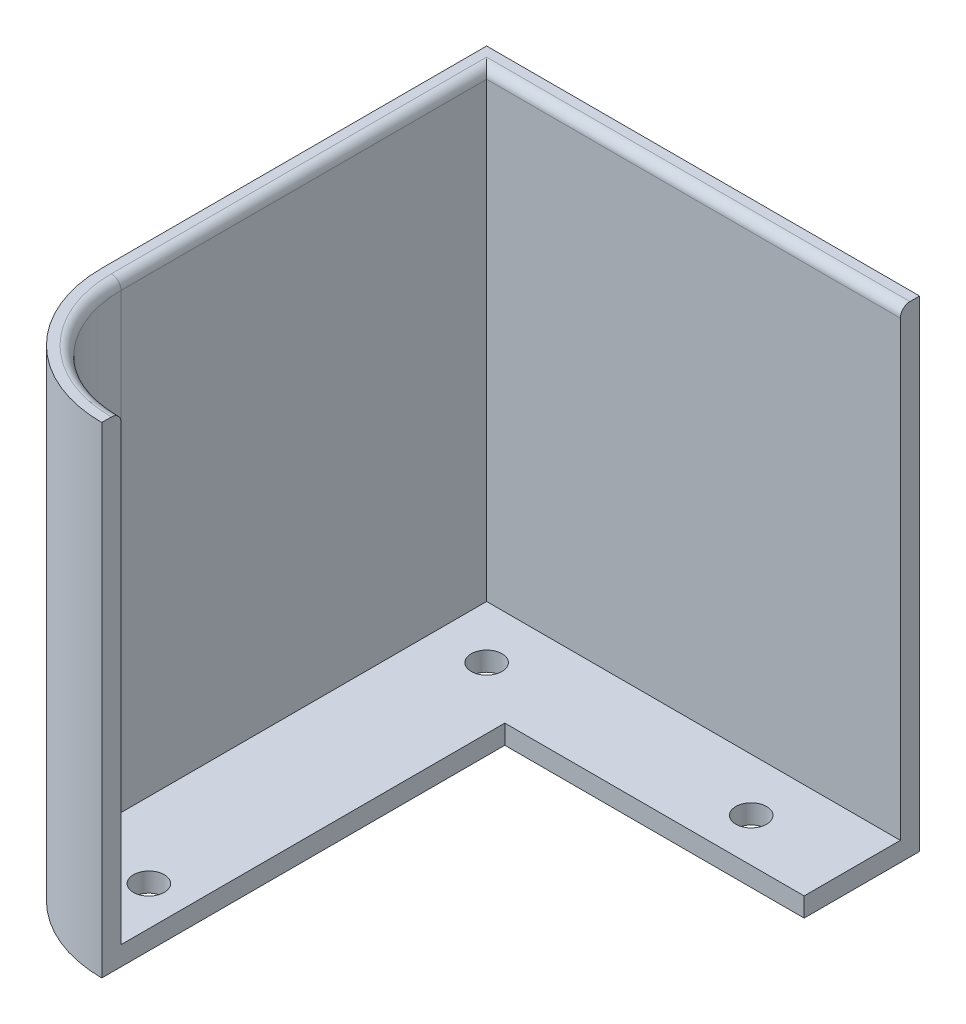
ISO-10303-21;
HEADER;
FILE_DESCRIPTION(('STEP AP214'),'2;1');
FILE_NAME('part.step','',(''),(''),'','','');
FILE_SCHEMA(('AUTOMOTIVE_DESIGN { 1 0 10303 214 1 1 1 1 }'));
ENDSEC;
DATA;
#1=APPLICATION_CONTEXT('core data for automotive mechanical design processes');
#2=APPLICATION_PROTOCOL_DEFINITION('international standard','automotive_design',2000,#1);
#3=PRODUCT_CONTEXT('',#1,'mechanical');
#4=PRODUCT('Part','Part','',(#3));
#5=PRODUCT_RELATED_PRODUCT_CATEGORY('part','',(#4));
#6=PRODUCT_DEFINITION_FORMATION('','',#4);
#7=PRODUCT_DEFINITION_CONTEXT('part definition',#1,'design');
#8=PRODUCT_DEFINITION('design','',#6,#7);
#9=PRODUCT_DEFINITION_SHAPE('','',#8);
#10=(LENGTH_UNIT() NAMED_UNIT(*) SI_UNIT(.MILLI.,.METRE.));
#11=(NAMED_UNIT(*) PLANE_ANGLE_UNIT() SI_UNIT($,.RADIAN.));
#12=(NAMED_UNIT(*) SI_UNIT($,.STERADIAN.) SOLID_ANGLE_UNIT());
#13=UNCERTAINTY_MEASURE_WITH_UNIT(LENGTH_MEASURE(1.E-05),#10,'distance_accuracy_value','');
#14=(GEOMETRIC_REPRESENTATION_CONTEXT(3) GLOBAL_UNCERTAINTY_ASSIGNED_CONTEXT((#13)) GLOBAL_UNIT_ASSIGNED_CONTEXT((#10,
#11,#12)) REPRESENTATION_CONTEXT('',''));
#15=CARTESIAN_POINT('',(0.,0.,0.));
#16=DIRECTION('',(0.,0.,1.));
#17=DIRECTION('',(1.,0.,0.));
#18=AXIS2_PLACEMENT_3D('',#15,#16,#17);
#19=CARTESIAN_POINT('',(834.147942738443,50.,37.404824393963));
#20=DIRECTION('',(0.,0.,-1.));
#21=DIRECTION('',(-1.,0.,0.));
#22=AXIS2_PLACEMENT_3D('',#19,#20,#21);
#23=PLANE('',#22);
#24=DIRECTION('',(1.,0.,0.));
#25=VECTOR('',#24,1.);
#26=CARTESIAN_POINT('',(834.147942738443,2.,37.404824393963));
#27=LINE('',#26,#25);
#28=CARTESIAN_POINT('',(803.037942738443,2.,37.404824393963));
#29=VERTEX_POINT('',#28);
#30=CARTESIAN_POINT('',(834.147942738443,2.,37.404824393963));
#31=VERTEX_POINT('',#30);
#32=EDGE_CURVE('E131',#29,#31,#27,.T.);
#33=ORIENTED_EDGE('',*,*,#32,.F.);
#34=DIRECTION('',(0.,-1.,0.));
#35=VECTOR('',#34,1.);
#36=CARTESIAN_POINT('',(803.037942738443,50.,37.404824393963));
#37=LINE('',#36,#35);
#38=CARTESIAN_POINT('',(803.037942738443,0.,37.404824393963));
#39=VERTEX_POINT('',#38);
#40=EDGE_CURVE('E195',#29,#39,#37,.T.);
#41=ORIENTED_EDGE('',*,*,#40,.T.);
#42=DIRECTION('',(1.,0.,0.));
#43=VECTOR('',#42,1.);
#44=CARTESIAN_POINT('',(834.147942738443,0.,37.404824393963));
#45=LINE('',#44,#43);
#46=CARTESIAN_POINT('',(834.147942738443,0.,37.404824393963));
#47=VERTEX_POINT('',#46);
#48=EDGE_CURVE('E177',#39,#47,#45,.T.);
#49=ORIENTED_EDGE('',*,*,#48,.T.);
#50=DIRECTION('',(0.,-1.,0.));
#51=VECTOR('',#50,1.);
#52=CARTESIAN_POINT('',(834.147942738443,50.,37.404824393963));
#53=LINE('',#52,#51);
#54=EDGE_CURVE('E193',#31,#47,#53,.T.);
#55=ORIENTED_EDGE('',*,*,#54,.F.);
#56=EDGE_LOOP('',(#33,#41,#49,#55));
#57=FACE_BOUND('',#56,.T.);
#58=ADVANCED_FACE('F33',(#57),#23,.F.);
#59=CARTESIAN_POINT('',(803.037942738443,50.,65.404824393963));
#60=DIRECTION('',(0.,-1.,0.));
#61=DIRECTION('',(0.,0.,-1.));
#62=AXIS2_PLACEMENT_3D('',#59,#60,#61);
#63=CYLINDRICAL_SURFACE('',#62,13.89);
#64=CARTESIAN_POINT('',(803.037942738443,0.,65.404824393963));
#65=DIRECTION('',(0.,1.,0.));
#66=DIRECTION('',(0.,0.,1.));
#67=AXIS2_PLACEMENT_3D('',#64,#65,#66);
#68=CIRCLE('',#67,13.89);
#69=CARTESIAN_POINT('',(789.147942738443,0.,65.404824393963));
#70=VERTEX_POINT('',#69);
#71=CARTESIAN_POINT('',(803.037942738443,0.,79.294824393963));
#72=VERTEX_POINT('',#71);
#73=EDGE_CURVE('E157',#70,#72,#68,.T.);
#74=ORIENTED_EDGE('',*,*,#73,.T.);
#75=DIRECTION('',(0.,-1.,0.));
#76=VECTOR('',#75,1.);
#77=CARTESIAN_POINT('',(803.037942738443,50.,79.294824393963));
#78=LINE('',#77,#76);
#79=CARTESIAN_POINT('',(803.037942738443,50.,79.294824393963));
#80=VERTEX_POINT('',#79);
#81=EDGE_CURVE('E197',#80,#72,#78,.T.);
#82=ORIENTED_EDGE('',*,*,#81,.F.);
#83=CARTESIAN_POINT('',(803.037942738443,50.,65.404824393963));
#84=DIRECTION('',(0.,1.,0.));
#85=DIRECTION('',(0.,0.,1.));
#86=AXIS2_PLACEMENT_3D('',#83,#84,#85);
#87=CIRCLE('',#86,13.89);
#88=CARTESIAN_POINT('',(789.147942738443,50.,65.404824393963));
#89=VERTEX_POINT('',#88);
#90=EDGE_CURVE('E158',#89,#80,#87,.T.);
#91=ORIENTED_EDGE('',*,*,#90,.F.);
#92=DIRECTION('',(0.,-1.,0.));
#93=VECTOR('',#92,1.);
#94=CARTESIAN_POINT('',(789.147942738443,50.,65.404824393963));
#95=LINE('',#94,#93);
#96=EDGE_CURVE('E171',#89,#70,#95,.T.);
#97=ORIENTED_EDGE('',*,*,#96,.T.);
#98=EDGE_LOOP('',(#74,#82,#91,#97));
#99=FACE_BOUND('',#98,.T.);
#100=ADVANCED_FACE('F226',(#99),#63,.T.);
#101=CARTESIAN_POINT('',(803.037942738443,50.,37.404824393963));
#102=DIRECTION('',(-1.,0.,0.));
#103=DIRECTION('',(0.,0.,1.));
#104=AXIS2_PLACEMENT_3D('',#101,#102,#103);
#105=PLANE('',#104);
#106=DIRECTION('',(0.,1.,0.));
#107=VECTOR('',#106,1.);
#108=CARTESIAN_POINT('',(803.037942738443,2.,77.292949065126));
#109=LINE('',#108,#107);
#110=CARTESIAN_POINT('',(803.037942738443,2.,77.292949065126));
#111=VERTEX_POINT('',#110);
#112=CARTESIAN_POINT('',(803.037942738443,49.,77.292949065126));
#113=VERTEX_POINT('',#112);
#114=EDGE_CURVE('E155',#111,#113,#109,.T.);
#115=ORIENTED_EDGE('',*,*,#114,.T.);
#116=CARTESIAN_POINT('',(803.037942738443,49.,77.292949065126));
#117=CARTESIAN_POINT('',(803.037942738443,49.0281347513319,77.2929492522533));
#118=CARTESIAN_POINT('',(803.037942738443,49.0562560239244,77.2941371563943));
#119=CARTESIAN_POINT('',(803.037942738443,49.1122973376035,77.2988761894594));
#120=CARTESIAN_POINT('',(803.037942738443,49.1402173882776,77.3024272050244));
#121=CARTESIAN_POINT('',(803.037942738443,49.2233269064969,77.3165911890609));
#122=CARTESIAN_POINT('',(803.037942738443,49.2779596711164,77.330715188433));
#123=CARTESIAN_POINT('',(803.037942738443,49.3840769886313,77.3679342934308));
#124=CARTESIAN_POINT('',(803.037942738443,49.4355600164811,77.3910337056185));
#125=CARTESIAN_POINT('',(803.037942738443,49.5339158006882,77.4455455200571));
#126=CARTESIAN_POINT('',(803.037942738443,49.5807893673233,77.4769564576645));
#127=CARTESIAN_POINT('',(803.037942738443,49.6685958185972,77.5472001317219));
#128=CARTESIAN_POINT('',(803.037942738443,49.7095287610894,77.5860327958864));
#129=CARTESIAN_POINT('',(803.037942738443,49.7843029733326,77.6700282287329));
#130=CARTESIAN_POINT('',(803.037942738443,49.8181428542143,77.7151922342506));
#131=CARTESIAN_POINT('',(803.037942738443,49.8777642830733,77.8105648872199));
#132=CARTESIAN_POINT('',(803.037942738443,49.9035442530213,77.8607745200024));
#133=CARTESIAN_POINT('',(803.037942738443,49.946295478094,77.9647993692165));
#134=CARTESIAN_POINT('',(803.037942738443,49.9632718931061,78.0186124526818));
#135=CARTESIAN_POINT('',(803.037942738443,49.9837151364928,78.1094538790678));
#136=CARTESIAN_POINT('',(803.037942738443,49.9898182693749,78.1459107643236));
#137=CARTESIAN_POINT('',(803.037942738443,49.9979601631979,78.2192230304868));
#138=CARTESIAN_POINT('',(803.037942738443,50.0000046853299,78.2560777717595));
#139=CARTESIAN_POINT('',(803.037942738443,50.,78.292949076601));
#140=B_SPLINE_CURVE_WITH_KNOTS('',3,(#116,#117,#118,#119,#120,#121,#122,#123,#124,#125,#126,
#127,#128,#129,#130,#131,#132,#133,#134,#135,#136,#137,#138,#139),.UNSPECIFIED.,.F.,.F.,(4,2,2,
2,2,2,2,2,2,2,2,4),(0.,0.0843524106021349,0.168700775089577,0.3371192980767,0.505618731241021,
0.674088491461,0.842556610916597,1.01105768681378,1.179591732472,1.34802688598839,
1.45870913501993,1.56923415811788),.UNSPECIFIED.);
#141=CARTESIAN_POINT('',(803.037942738443,50.,78.292949076601));
#142=VERTEX_POINT('',#141);
#143=EDGE_CURVE('E11',#113,#142,#140,.T.);
#144=ORIENTED_EDGE('',*,*,#143,.T.);
#145=DIRECTION('',(0.,0.,-1.));
#146=VECTOR('',#145,1.);
#147=CARTESIAN_POINT('',(803.037942738443,50.,58.8072634183529));
#148=LINE('',#147,#146);
#149=EDGE_CURVE('E161',#80,#142,#148,.T.);
#150=ORIENTED_EDGE('',*,*,#149,.F.);
#151=ORIENTED_EDGE('',*,*,#81,.T.);
#152=DIRECTION('',(0.,0.,-1.));
#153=VECTOR('',#152,1.);
#154=CARTESIAN_POINT('',(803.037942738443,0.,37.404824393963));
#155=LINE('',#154,#153);
#156=EDGE_CURVE('E174',#72,#39,#155,.T.);
#157=ORIENTED_EDGE('',*,*,#156,.T.);
#158=ORIENTED_EDGE('',*,*,#40,.F.);
#159=DIRECTION('',(0.,0.,-1.));
#160=VECTOR('',#159,1.);
#161=CARTESIAN_POINT('',(803.037942738443,2.,37.404824393963));
#162=LINE('',#161,#160);
#163=EDGE_CURVE('E154',#111,#29,#162,.T.);
#164=ORIENTED_EDGE('',*,*,#163,.F.);
#165=EDGE_LOOP('',(#115,#144,#150,#151,#157,#158,#164));
#166=FACE_BOUND('',#165,.T.);
#167=ADVANCED_FACE('F221',(#166),#105,.F.);
#168=CARTESIAN_POINT('',(834.147942738443,50.,25.404824393963));
#169=DIRECTION('',(-1.,0.,0.));
#170=DIRECTION('',(0.,0.,1.));
#171=AXIS2_PLACEMENT_3D('',#168,#169,#170);
#172=PLANE('',#171);
#173=DIRECTION('',(0.,0.,-1.));
#174=VECTOR('',#173,1.);
#175=CARTESIAN_POINT('',(834.147942738443,50.,25.404824393963));
#176=LINE('',#175,#174);
#177=CARTESIAN_POINT('',(834.147942738443,50.,26.4048243939621));
#178=VERTEX_POINT('',#177);
#179=CARTESIAN_POINT('',(834.147942738443,50.,25.404824393963));
#180=VERTEX_POINT('',#179);
#181=EDGE_CURVE('E165',#178,#180,#176,.T.);
#182=ORIENTED_EDGE('',*,*,#181,.F.);
#183=CARTESIAN_POINT('',(834.147942738443,49.,26.4048243939621));
#184=DIRECTION('',(-1.,0.,0.));
#185=DIRECTION('',(0.,0.,1.));
#186=AXIS2_PLACEMENT_3D('',#183,#184,#185);
#187=CIRCLE('',#186,1.);
#188=CARTESIAN_POINT('',(834.147942738443,49.,27.4048243939621));
#189=VERTEX_POINT('',#188);
#190=EDGE_CURVE('E57',#178,#189,#187,.F.);
#191=ORIENTED_EDGE('',*,*,#190,.T.);
#192=DIRECTION('',(0.,1.,0.));
#193=VECTOR('',#192,1.);
#194=CARTESIAN_POINT('',(834.147942738443,2.,27.4048243939621));
#195=LINE('',#194,#193);
#196=CARTESIAN_POINT('',(834.147942738443,2.,27.4048243939621));
#197=VERTEX_POINT('',#196);
#198=EDGE_CURVE('E137',#197,#189,#195,.T.);
#199=ORIENTED_EDGE('',*,*,#198,.F.);
#200=DIRECTION('',(0.,0.,-1.));
#201=VECTOR('',#200,1.);
#202=CARTESIAN_POINT('',(834.147942738443,2.,27.4048243939621));
#203=LINE('',#202,#201);
#204=EDGE_CURVE('E125',#31,#197,#203,.T.);
#205=ORIENTED_EDGE('',*,*,#204,.F.);
#206=ORIENTED_EDGE('',*,*,#54,.T.);
#207=DIRECTION('',(0.,0.,-1.));
#208=VECTOR('',#207,1.);
#209=CARTESIAN_POINT('',(834.147942738443,0.,25.404824393963));
#210=LINE('',#209,#208);
#211=CARTESIAN_POINT('',(834.147942738443,0.,25.404824393963));
#212=VERTEX_POINT('',#211);
#213=EDGE_CURVE('E180',#47,#212,#210,.T.);
#214=ORIENTED_EDGE('',*,*,#213,.T.);
#215=DIRECTION('',(0.,-1.,0.));
#216=VECTOR('',#215,1.);
#217=CARTESIAN_POINT('',(834.147942738443,50.,25.404824393963));
#218=LINE('',#217,#216);
#219=EDGE_CURVE('E190',#180,#212,#218,.T.);
#220=ORIENTED_EDGE('',*,*,#219,.F.);
#221=EDGE_LOOP('',(#182,#191,#199,#205,#206,#214,#220));
#222=FACE_BOUND('',#221,.T.);
#223=ADVANCED_FACE('F144',(#222),#172,.F.);
#224=CARTESIAN_POINT('',(789.147942738443,50.,25.404824393963));
#225=DIRECTION('',(0.,0.,1.));
#226=DIRECTION('',(1.,0.,0.));
#227=AXIS2_PLACEMENT_3D('',#224,#225,#226);
#228=PLANE('',#227);
#229=DIRECTION('',(-1.,0.,0.));
#230=VECTOR('',#229,1.);
#231=CARTESIAN_POINT('',(789.147942738443,0.,25.404824393963));
#232=LINE('',#231,#230);
#233=CARTESIAN_POINT('',(789.147942738443,0.,25.404824393963));
#234=VERTEX_POINT('',#233);
#235=EDGE_CURVE('E182',#212,#234,#232,.T.);
#236=ORIENTED_EDGE('',*,*,#235,.T.);
#237=DIRECTION('',(0.,-1.,0.));
#238=VECTOR('',#237,1.);
#239=CARTESIAN_POINT('',(789.147942738443,50.,25.404824393963));
#240=LINE('',#239,#238);
#241=CARTESIAN_POINT('',(789.147942738443,50.,25.404824393963));
#242=VERTEX_POINT('',#241);
#243=EDGE_CURVE('E187',#242,#234,#240,.T.);
#244=ORIENTED_EDGE('',*,*,#243,.F.);
#245=DIRECTION('',(-1.,0.,0.));
#246=VECTOR('',#245,1.);
#247=CARTESIAN_POINT('',(789.147942738443,50.,25.404824393963));
#248=LINE('',#247,#246);
#249=EDGE_CURVE('E167',#180,#242,#248,.T.);
#250=ORIENTED_EDGE('',*,*,#249,.F.);
#251=ORIENTED_EDGE('',*,*,#219,.T.);
#252=EDGE_LOOP('',(#236,#244,#250,#251));
#253=FACE_BOUND('',#252,.T.);
#254=ADVANCED_FACE('F258',(#253),#228,.F.);
#255=CARTESIAN_POINT('',(789.147942738443,50.,65.404824393963));
#256=DIRECTION('',(1.,0.,0.));
#257=DIRECTION('',(0.,0.,-1.));
#258=AXIS2_PLACEMENT_3D('',#255,#256,#257);
#259=PLANE('',#258);
#260=DIRECTION('',(0.,0.,1.));
#261=VECTOR('',#260,1.);
#262=CARTESIAN_POINT('',(789.147942738443,0.,65.404824393963));
#263=LINE('',#262,#261);
#264=EDGE_CURVE('E162',#234,#70,#263,.T.);
#265=ORIENTED_EDGE('',*,*,#264,.T.);
#266=ORIENTED_EDGE('',*,*,#96,.F.);
#267=DIRECTION('',(0.,0.,1.));
#268=VECTOR('',#267,1.);
#269=CARTESIAN_POINT('',(789.147942738443,50.,65.404824393963));
#270=LINE('',#269,#268);
#271=EDGE_CURVE('E169',#242,#89,#270,.T.);
#272=ORIENTED_EDGE('',*,*,#271,.F.);
#273=ORIENTED_EDGE('',*,*,#243,.T.);
#274=EDGE_LOOP('',(#265,#266,#272,#273));
#275=FACE_BOUND('',#274,.T.);
#276=ADVANCED_FACE('F333',(#275),#259,.F.);
#277=CARTESIAN_POINT('',(803.037942738443,50.,65.404824393963));
#278=DIRECTION('',(0.,1.,0.));
#279=DIRECTION('',(0.,0.,1.));
#280=AXIS2_PLACEMENT_3D('',#277,#278,#279);
#281=PLANE('',#280);
#282=DIRECTION('',(0.,0.,1.));
#283=VECTOR('',#282,1.);
#284=CARTESIAN_POINT('',(790.147942738443,50.,27.4048243939621));
#285=LINE('',#284,#283);
#286=CARTESIAN_POINT('',(790.147942738443,50.,65.4048243939621));
#287=VERTEX_POINT('',#286);
#288=CARTESIAN_POINT('',(790.147942738443,50.,26.4048243939621));
#289=VERTEX_POINT('',#288);
#290=EDGE_CURVE('E205',#287,#289,#285,.F.);
#291=ORIENTED_EDGE('',*,*,#290,.T.);
#292=DIRECTION('',(-1.,0.,0.));
#293=VECTOR('',#292,1.);
#294=CARTESIAN_POINT('',(834.147942738443,50.,26.4048243939621));
#295=LINE('',#294,#293);
#296=EDGE_CURVE('E207',#289,#178,#295,.F.);
#297=ORIENTED_EDGE('',*,*,#296,.T.);
#298=ORIENTED_EDGE('',*,*,#181,.T.);
#299=ORIENTED_EDGE('',*,*,#249,.T.);
#300=ORIENTED_EDGE('',*,*,#271,.T.);
#301=ORIENTED_EDGE('',*,*,#90,.T.);
#302=ORIENTED_EDGE('',*,*,#149,.T.);
#303=CARTESIAN_POINT('',(803.036067557498,50.,65.4048243939622));
#304=DIRECTION('',(0.,1.,0.));
#305=DIRECTION('',(0.,0.,1.));
#306=AXIS2_PLACEMENT_3D('',#303,#304,#305);
#307=CIRCLE('',#306,12.8881248190552);
#308=EDGE_CURVE('E203',#142,#287,#307,.F.);
#309=ORIENTED_EDGE('',*,*,#308,.T.);
#310=EDGE_LOOP('',(#291,#297,#298,#299,#300,#301,#302,#309));
#311=FACE_BOUND('',#310,.T.);
#312=ADVANCED_FACE('F262',(#311),#281,.T.);
#313=CARTESIAN_POINT('',(803.037942738443,0.,65.404824393963));
#314=DIRECTION('',(0.,1.,0.));
#315=DIRECTION('',(0.,0.,1.));
#316=AXIS2_PLACEMENT_3D('',#313,#314,#315);
#317=PLANE('',#316);
#318=CARTESIAN_POINT('',(824.147942738443,0.,32.904824393963));
#319=DIRECTION('',(0.,1.,0.));
#320=DIRECTION('',(0.,0.,1.));
#321=AXIS2_PLACEMENT_3D('',#318,#319,#320);
#322=CIRCLE('',#321,1.60000000000002);
#323=CARTESIAN_POINT('',(824.147942738443,0.,34.504824393963));
#324=VERTEX_POINT('',#323);
#325=EDGE_CURVE('E133',#324,#324,#322,.T.);
#326=ORIENTED_EDGE('',*,*,#325,.T.);
#327=EDGE_LOOP('',(#326));
#328=FACE_BOUND('',#327,.T.);
#329=CARTESIAN_POINT('',(796.647942738443,0.,32.904824393963));
#330=DIRECTION('',(0.,1.,0.));
#331=DIRECTION('',(0.,0.,1.));
#332=AXIS2_PLACEMENT_3D('',#329,#330,#331);
#333=CIRCLE('',#332,1.60000000000002);
#334=CARTESIAN_POINT('',(796.647942738443,0.,34.504824393963));
#335=VERTEX_POINT('',#334);
#336=EDGE_CURVE('E290',#335,#335,#333,.T.);
#337=ORIENTED_EDGE('',*,*,#336,.T.);
#338=EDGE_LOOP('',(#337));
#339=FACE_BOUND('',#338,.T.);
#340=CARTESIAN_POINT('',(798.982858951962,0.,70.344824393963));
#341=DIRECTION('',(0.,1.,0.));
#342=DIRECTION('',(0.,0.,1.));
#343=AXIS2_PLACEMENT_3D('',#340,#341,#342);
#344=CIRCLE('',#343,1.60000000000002);
#345=CARTESIAN_POINT('',(798.982858951962,0.,71.944824393963));
#346=VERTEX_POINT('',#345);
#347=EDGE_CURVE('E280',#346,#346,#344,.T.);
#348=ORIENTED_EDGE('',*,*,#347,.T.);
#349=EDGE_LOOP('',(#348));
#350=FACE_BOUND('',#349,.T.);
#351=ORIENTED_EDGE('',*,*,#73,.F.);
#352=ORIENTED_EDGE('',*,*,#264,.F.);
#353=ORIENTED_EDGE('',*,*,#235,.F.);
#354=ORIENTED_EDGE('',*,*,#213,.F.);
#355=ORIENTED_EDGE('',*,*,#48,.F.);
#356=ORIENTED_EDGE('',*,*,#156,.F.);
#357=EDGE_LOOP('',(#351,#352,#353,#354,#355,#356));
#358=FACE_BOUND('',#357,.T.);
#359=ADVANCED_FACE('F252',(#328,#339,#350,#358),#317,.F.);
#360=CARTESIAN_POINT('',(803.036067557498,2.,65.4048243939622));
#361=DIRECTION('',(0.,1.,0.));
#362=DIRECTION('',(0.,0.,1.));
#363=AXIS2_PLACEMENT_3D('',#360,#361,#362);
#364=PLANE('',#363);
#365=CARTESIAN_POINT('',(824.147942738443,2.,32.904824393963));
#366=DIRECTION('',(0.,1.,0.));
#367=DIRECTION('',(0.,0.,1.));
#368=AXIS2_PLACEMENT_3D('',#365,#366,#367);
#369=CIRCLE('',#368,1.60000000000002);
#370=CARTESIAN_POINT('',(824.147942738443,2.,34.504824393963));
#371=VERTEX_POINT('',#370);
#372=EDGE_CURVE('E293',#371,#371,#369,.T.);
#373=ORIENTED_EDGE('',*,*,#372,.F.);
#374=EDGE_LOOP('',(#373));
#375=FACE_BOUND('',#374,.T.);
#376=CARTESIAN_POINT('',(796.647942738443,2.,32.904824393963));
#377=DIRECTION('',(0.,1.,0.));
#378=DIRECTION('',(0.,0.,1.));
#379=AXIS2_PLACEMENT_3D('',#376,#377,#378);
#380=CIRCLE('',#379,1.60000000000002);
#381=CARTESIAN_POINT('',(796.647942738443,2.,34.504824393963));
#382=VERTEX_POINT('',#381);
#383=EDGE_CURVE('E285',#382,#382,#380,.T.);
#384=ORIENTED_EDGE('',*,*,#383,.F.);
#385=EDGE_LOOP('',(#384));
#386=FACE_BOUND('',#385,.T.);
#387=CARTESIAN_POINT('',(798.982858951962,2.,70.344824393963));
#388=DIRECTION('',(0.,1.,0.));
#389=DIRECTION('',(0.,0.,1.));
#390=AXIS2_PLACEMENT_3D('',#387,#388,#389);
#391=CIRCLE('',#390,1.60000000000002);
#392=CARTESIAN_POINT('',(798.982858951962,2.,71.944824393963));
#393=VERTEX_POINT('',#392);
#394=EDGE_CURVE('E278',#393,#393,#391,.T.);
#395=ORIENTED_EDGE('',*,*,#394,.F.);
#396=EDGE_LOOP('',(#395));
#397=FACE_BOUND('',#396,.T.);
#398=ORIENTED_EDGE('',*,*,#163,.T.);
#399=ORIENTED_EDGE('',*,*,#32,.T.);
#400=ORIENTED_EDGE('',*,*,#204,.T.);
#401=DIRECTION('',(-1.,0.,0.));
#402=VECTOR('',#401,1.);
#403=CARTESIAN_POINT('',(834.147942738443,2.,27.4048243939621));
#404=LINE('',#403,#402);
#405=CARTESIAN_POINT('',(791.147942738443,2.,27.4048243939621));
#406=VERTEX_POINT('',#405);
#407=EDGE_CURVE('E129',#197,#406,#404,.T.);
#408=ORIENTED_EDGE('',*,*,#407,.T.);
#409=DIRECTION('',(0.,0.,1.));
#410=VECTOR('',#409,1.);
#411=CARTESIAN_POINT('',(791.147942738443,2.,27.4048243939621));
#412=LINE('',#411,#410);
#413=CARTESIAN_POINT('',(791.147942738443,2.,65.4048243939621));
#414=VERTEX_POINT('',#413);
#415=EDGE_CURVE('E142',#406,#414,#412,.T.);
#416=ORIENTED_EDGE('',*,*,#415,.T.);
#417=CARTESIAN_POINT('',(803.036067557498,2.,65.4048243939622));
#418=DIRECTION('',(0.,1.,0.));
#419=DIRECTION('',(0.,0.,1.));
#420=AXIS2_PLACEMENT_3D('',#417,#418,#419);
#421=CIRCLE('',#420,11.8881248190552);
#422=EDGE_CURVE('E145',#414,#111,#421,.T.);
#423=ORIENTED_EDGE('',*,*,#422,.T.);
#424=EDGE_LOOP('',(#398,#399,#400,#408,#416,#423));
#425=FACE_BOUND('',#424,.T.);
#426=ADVANCED_FACE('F127',(#375,#386,#397,#425),#364,.T.);
#427=CARTESIAN_POINT('',(803.036067557498,2.,65.4048243939622));
#428=DIRECTION('',(0.,1.,0.));
#429=DIRECTION('',(0.,0.,1.));
#430=AXIS2_PLACEMENT_3D('',#427,#428,#429);
#431=CYLINDRICAL_SURFACE('',#430,11.8881248190552);
#432=DIRECTION('',(0.,1.,0.));
#433=VECTOR('',#432,1.);
#434=CARTESIAN_POINT('',(791.147942738443,2.,65.4048243939621));
#435=LINE('',#434,#433);
#436=CARTESIAN_POINT('',(791.147942738443,49.,65.4048243939621));
#437=VERTEX_POINT('',#436);
#438=EDGE_CURVE('E147',#414,#437,#435,.T.);
#439=ORIENTED_EDGE('',*,*,#438,.T.);
#440=CARTESIAN_POINT('',(803.036067557498,49.,65.4048243939622));
#441=DIRECTION('',(0.,1.,0.));
#442=DIRECTION('',(0.,0.,1.));
#443=AXIS2_PLACEMENT_3D('',#440,#441,#442);
#444=CIRCLE('',#443,11.8881248190552);
#445=EDGE_CURVE('E42',#437,#113,#444,.T.);
#446=ORIENTED_EDGE('',*,*,#445,.T.);
#447=ORIENTED_EDGE('',*,*,#114,.F.);
#448=ORIENTED_EDGE('',*,*,#422,.F.);
#449=EDGE_LOOP('',(#439,#446,#447,#448));
#450=FACE_BOUND('',#449,.T.);
#451=ADVANCED_FACE('F273',(#450),#431,.F.);
#452=CARTESIAN_POINT('',(791.147942738443,2.,27.4048243939621));
#453=DIRECTION('',(-1.,0.,0.));
#454=DIRECTION('',(0.,0.,1.));
#455=AXIS2_PLACEMENT_3D('',#452,#453,#454);
#456=PLANE('',#455);
#457=DIRECTION('',(0.,1.,0.));
#458=VECTOR('',#457,1.);
#459=CARTESIAN_POINT('',(791.147942738443,2.,27.4048243939621));
#460=LINE('',#459,#458);
#461=CARTESIAN_POINT('',(791.147942738443,49.,27.4048243939621));
#462=VERTEX_POINT('',#461);
#463=EDGE_CURVE('E140',#406,#462,#460,.T.);
#464=ORIENTED_EDGE('',*,*,#463,.T.);
#465=DIRECTION('',(0.,0.,1.));
#466=VECTOR('',#465,1.);
#467=CARTESIAN_POINT('',(791.147942738443,49.,65.4048243939621));
#468=LINE('',#467,#466);
#469=EDGE_CURVE('E200',#462,#437,#468,.T.);
#470=ORIENTED_EDGE('',*,*,#469,.T.);
#471=ORIENTED_EDGE('',*,*,#438,.F.);
#472=ORIENTED_EDGE('',*,*,#415,.F.);
#473=EDGE_LOOP('',(#464,#470,#471,#472));
#474=FACE_BOUND('',#473,.T.);
#475=ADVANCED_FACE('F269',(#474),#456,.F.);
#476=CARTESIAN_POINT('',(834.147942738443,2.,27.4048243939621));
#477=DIRECTION('',(0.,0.,-1.));
#478=DIRECTION('',(-1.,0.,0.));
#479=AXIS2_PLACEMENT_3D('',#476,#477,#478);
#480=PLANE('',#479);
#481=ORIENTED_EDGE('',*,*,#198,.T.);
#482=DIRECTION('',(-1.,0.,0.));
#483=VECTOR('',#482,1.);
#484=CARTESIAN_POINT('',(791.147942738443,49.,27.4048243939621));
#485=LINE('',#484,#483);
#486=EDGE_CURVE('E209',#189,#462,#485,.T.);
#487=ORIENTED_EDGE('',*,*,#486,.T.);
#488=ORIENTED_EDGE('',*,*,#463,.F.);
#489=ORIENTED_EDGE('',*,*,#407,.F.);
#490=EDGE_LOOP('',(#481,#487,#488,#489));
#491=FACE_BOUND('',#490,.T.);
#492=ADVANCED_FACE('F136',(#491),#480,.F.);
#493=CARTESIAN_POINT('',(798.982858951962,0.,70.344824393963));
#494=DIRECTION('',(0.,1.,0.));
#495=DIRECTION('',(0.,0.,1.));
#496=AXIS2_PLACEMENT_3D('',#493,#494,#495);
#497=CYLINDRICAL_SURFACE('',#496,1.60000000000002);
#498=ORIENTED_EDGE('',*,*,#347,.F.);
#499=EDGE_LOOP('',(#498));
#500=FACE_BOUND('',#499,.T.);
#501=ORIENTED_EDGE('',*,*,#394,.T.);
#502=EDGE_LOOP('',(#501));
#503=FACE_BOUND('',#502,.T.);
#504=ADVANCED_FACE('F315',(#500,#503),#497,.F.);
#505=CARTESIAN_POINT('',(796.647942738443,0.,32.904824393963));
#506=DIRECTION('',(0.,1.,0.));
#507=DIRECTION('',(0.,0.,1.));
#508=AXIS2_PLACEMENT_3D('',#505,#506,#507);
#509=CYLINDRICAL_SURFACE('',#508,1.60000000000002);
#510=ORIENTED_EDGE('',*,*,#336,.F.);
#511=EDGE_LOOP('',(#510));
#512=FACE_BOUND('',#511,.T.);
#513=ORIENTED_EDGE('',*,*,#383,.T.);
#514=EDGE_LOOP('',(#513));
#515=FACE_BOUND('',#514,.T.);
#516=ADVANCED_FACE('F304',(#512,#515),#509,.F.);
#517=CARTESIAN_POINT('',(824.147942738443,0.,32.904824393963));
#518=DIRECTION('',(0.,1.,0.));
#519=DIRECTION('',(0.,0.,1.));
#520=AXIS2_PLACEMENT_3D('',#517,#518,#519);
#521=CYLINDRICAL_SURFACE('',#520,1.60000000000002);
#522=ORIENTED_EDGE('',*,*,#325,.F.);
#523=EDGE_LOOP('',(#522));
#524=FACE_BOUND('',#523,.T.);
#525=ORIENTED_EDGE('',*,*,#372,.T.);
#526=EDGE_LOOP('',(#525));
#527=FACE_BOUND('',#526,.T.);
#528=ADVANCED_FACE('F301',(#524,#527),#521,.F.);
#529=CARTESIAN_POINT('',(834.147942738443,49.,26.4048243939621));
#530=DIRECTION('',(1.,0.,0.));
#531=DIRECTION('',(0.,0.,-1.));
#532=AXIS2_PLACEMENT_3D('',#529,#530,#531);
#533=CYLINDRICAL_SURFACE('',#532,1.);
#534=ORIENTED_EDGE('',*,*,#190,.F.);
#535=ORIENTED_EDGE('',*,*,#296,.F.);
#536=CARTESIAN_POINT('',(790.147942738443,49.,26.4048243939621));
#537=DIRECTION('',(0.707106781186547,0.,-0.707106781186548));
#538=DIRECTION('',(-0.707106781186548,0.,-0.707106781186547));
#539=AXIS2_PLACEMENT_3D('',#536,#537,#538);
#540=ELLIPSE('',#539,1.41421356237309,1.);
#541=EDGE_CURVE('E37',#462,#289,#540,.F.);
#542=ORIENTED_EDGE('',*,*,#541,.F.);
#543=ORIENTED_EDGE('',*,*,#486,.F.);
#544=EDGE_LOOP('',(#534,#535,#542,#543));
#545=FACE_BOUND('',#544,.T.);
#546=ADVANCED_FACE('F35',(#545),#533,.T.);
#547=CARTESIAN_POINT('',(803.036067557498,49.,65.4048243939622));
#548=DIRECTION('',(0.,1.,0.));
#549=DIRECTION('',(0.,0.,1.));
#550=AXIS2_PLACEMENT_3D('',#547,#548,#549);
#551=TOROIDAL_SURFACE('',#550,12.8881248190552,1.);
#552=ORIENTED_EDGE('',*,*,#143,.F.);
#553=ORIENTED_EDGE('',*,*,#445,.F.);
#554=CARTESIAN_POINT('',(790.147942738443,49.,65.4048243939621));
#555=DIRECTION('',(0.,0.,-1.));
#556=DIRECTION('',(-1.,0.,0.));
#557=AXIS2_PLACEMENT_3D('',#554,#555,#556);
#558=CIRCLE('',#557,1.);
#559=EDGE_CURVE('E217',#287,#437,#558,.T.);
#560=ORIENTED_EDGE('',*,*,#559,.F.);
#561=ORIENTED_EDGE('',*,*,#308,.F.);
#562=EDGE_LOOP('',(#552,#553,#560,#561));
#563=FACE_BOUND('',#562,.T.);
#564=ADVANCED_FACE('F218',(#563),#551,.T.);
#565=CARTESIAN_POINT('',(790.147942738443,49.,27.4048243939621));
#566=DIRECTION('',(0.,0.,-1.));
#567=DIRECTION('',(-1.,0.,0.));
#568=AXIS2_PLACEMENT_3D('',#565,#566,#567);
#569=CYLINDRICAL_SURFACE('',#568,1.);
#570=ORIENTED_EDGE('',*,*,#541,.T.);
#571=ORIENTED_EDGE('',*,*,#290,.F.);
#572=ORIENTED_EDGE('',*,*,#559,.T.);
#573=ORIENTED_EDGE('',*,*,#469,.F.);
#574=EDGE_LOOP('',(#570,#571,#572,#573));
#575=FACE_BOUND('',#574,.T.);
#576=ADVANCED_FACE('F231',(#575),#569,.T.);
#577=CLOSED_SHELL('',(#58,#100,#167,#223,#254,#276,#312,#359,#426,#451,#475,#492,#504,#516,#528,
#546,#564,#576));
#578=MANIFOLD_SOLID_BREP('B2',#577);
#579=ADVANCED_BREP_SHAPE_REPRESENTATION('',(#18,#578),#14);
#580=SHAPE_DEFINITION_REPRESENTATION(#9,#579);
ENDSEC;
END-ISO-10303-21;
